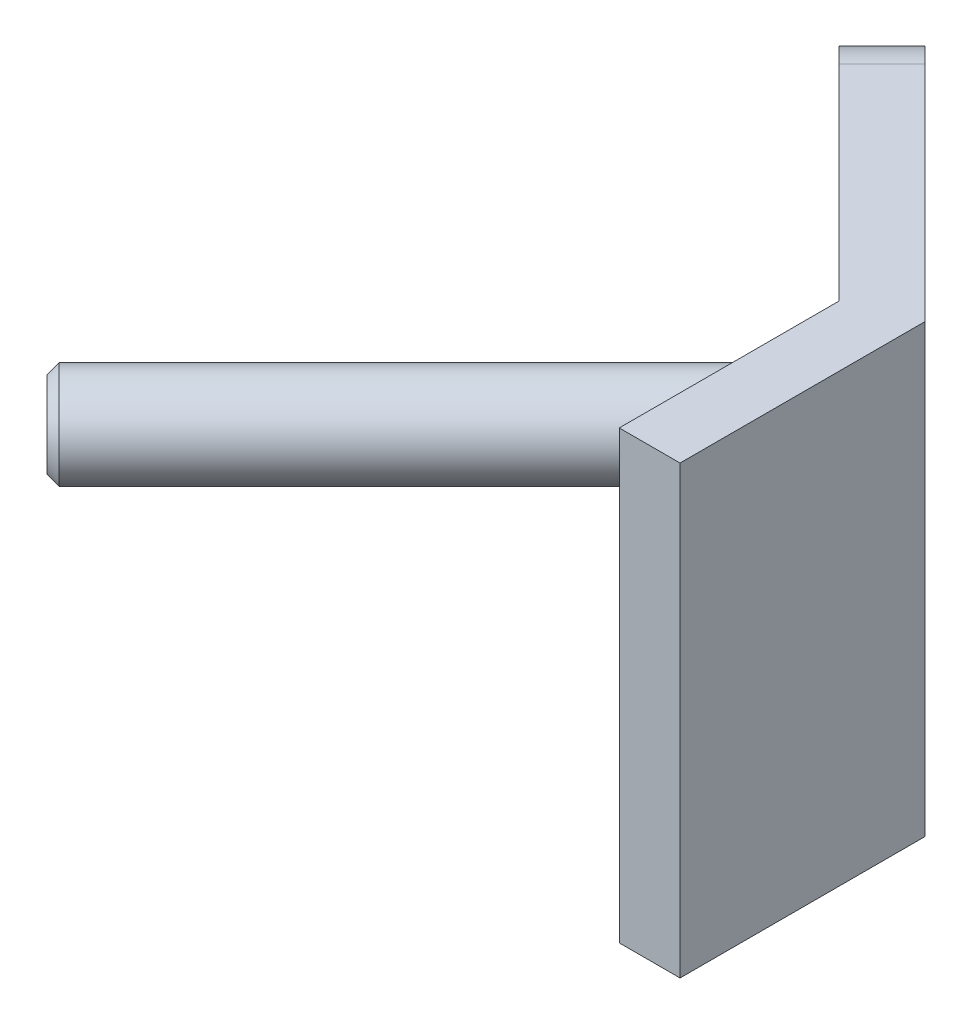
ISO-10303-21;
HEADER;
FILE_DESCRIPTION(('STEP AP214'),'2;1');
FILE_NAME('part.step','',(''),(''),'','','');
FILE_SCHEMA(('AUTOMOTIVE_DESIGN { 1 0 10303 214 1 1 1 1 }'));
ENDSEC;
DATA;
#1=APPLICATION_CONTEXT('core data for automotive mechanical design processes');
#2=APPLICATION_PROTOCOL_DEFINITION('international standard','automotive_design',2000,#1);
#3=PRODUCT_CONTEXT('',#1,'mechanical');
#4=PRODUCT('Part','Part','',(#3));
#5=PRODUCT_RELATED_PRODUCT_CATEGORY('part','',(#4));
#6=PRODUCT_DEFINITION_FORMATION('','',#4);
#7=PRODUCT_DEFINITION_CONTEXT('part definition',#1,'design');
#8=PRODUCT_DEFINITION('design','',#6,#7);
#9=PRODUCT_DEFINITION_SHAPE('','',#8);
#10=(LENGTH_UNIT() NAMED_UNIT(*) SI_UNIT(.MILLI.,.METRE.));
#11=(NAMED_UNIT(*) PLANE_ANGLE_UNIT() SI_UNIT($,.RADIAN.));
#12=(NAMED_UNIT(*) SI_UNIT($,.STERADIAN.) SOLID_ANGLE_UNIT());
#13=UNCERTAINTY_MEASURE_WITH_UNIT(LENGTH_MEASURE(1.E-05),#10,'distance_accuracy_value','');
#14=(GEOMETRIC_REPRESENTATION_CONTEXT(3) GLOBAL_UNCERTAINTY_ASSIGNED_CONTEXT((#13)) GLOBAL_UNIT_ASSIGNED_CONTEXT((#10,
#11,#12)) REPRESENTATION_CONTEXT('',''));
#15=CARTESIAN_POINT('',(0.,0.,0.));
#16=DIRECTION('',(0.,0.,1.));
#17=DIRECTION('',(1.,0.,0.));
#18=AXIS2_PLACEMENT_3D('',#15,#16,#17);
#19=CARTESIAN_POINT('',(-51.941801404264,0.,5.47010987737727));
#20=DIRECTION('',(0.707106781186548,0.,-0.707106781186547));
#21=DIRECTION('',(-0.707106781186547,0.,-0.707106781186548));
#22=AXIS2_PLACEMENT_3D('',#19,#20,#21);
#23=PLANE('',#22);
#24=CARTESIAN_POINT('',(-51.941801404264,0.,5.47010987737728));
#25=DIRECTION('',(0.707106781186548,0.,-0.707106781186547));
#26=DIRECTION('',(-0.707106781186547,0.,-0.707106781186548));
#27=AXIS2_PLACEMENT_3D('',#24,#25,#26);
#28=CIRCLE('',#27,3.175);
#29=CARTESIAN_POINT('',(-54.1868654345313,0.,3.22504584710999));
#30=VERTEX_POINT('',#29);
#31=EDGE_CURVE('E9',#30,#30,#28,.F.);
#32=ORIENTED_EDGE('',*,*,#31,.T.);
#33=EDGE_LOOP('',(#32));
#34=FACE_BOUND('',#33,.T.);
#35=ADVANCED_FACE('F15',(#34),#23,.F.);
#36=CARTESIAN_POINT('',(-105.823338130679,0.,59.3516466037921));
#37=DIRECTION('',(0.707106781186548,0.,-0.707106781186547));
#38=DIRECTION('',(-0.707106781186547,0.,-0.707106781186548));
#39=AXIS2_PLACEMENT_3D('',#36,#37,#38);
#40=CYLINDRICAL_SURFACE('',#39,3.96875);
#41=CARTESIAN_POINT('',(-51.3805353966972,0.,4.90884386981046));
#42=DIRECTION('',(0.707106781186547,0.,-0.707106781186547));
#43=DIRECTION('',(-0.707106781186548,0.,-0.707106781186548));
#44=AXIS2_PLACEMENT_3D('',#41,#42,#43);
#45=CIRCLE('',#44,3.96875);
#46=CARTESIAN_POINT('',(-54.1868654345313,0.,2.10251383197635));
#47=VERTEX_POINT('',#46);
#48=EDGE_CURVE('E23',#47,#47,#45,.T.);
#49=ORIENTED_EDGE('',*,*,#48,.T.);
#50=EDGE_LOOP('',(#49));
#51=FACE_BOUND('',#50,.T.);
#52=CARTESIAN_POINT('',(-16.0207769199874,0.,-30.4509146068993));
#53=DIRECTION('',(0.707106781186548,0.,-0.707106781186547));
#54=DIRECTION('',(-0.707106781186547,0.,-0.707106781186548));
#55=AXIS2_PLACEMENT_3D('',#52,#53,#54);
#56=CIRCLE('',#55,3.96875);
#57=CARTESIAN_POINT('',(-18.8271069578215,0.,-33.2572446447334));
#58=VERTEX_POINT('',#57);
#59=EDGE_CURVE('E128',#58,#58,#56,.T.);
#60=ORIENTED_EDGE('',*,*,#59,.F.);
#61=EDGE_LOOP('',(#60));
#62=FACE_BOUND('',#61,.T.);
#63=ADVANCED_FACE('F134',(#51,#62),#40,.T.);
#64=CARTESIAN_POINT('',(0.,-20.2184,0.));
#65=DIRECTION('',(-1.,0.,0.));
#66=DIRECTION('',(0.,0.,1.));
#67=AXIS2_PLACEMENT_3D('',#64,#65,#66);
#68=PLANE('',#67);
#69=DIRECTION('',(0.,0.,1.));
#70=VECTOR('',#69,1.);
#71=CARTESIAN_POINT('',(0.,20.2184,0.));
#72=LINE('',#71,#70);
#73=CARTESIAN_POINT('',(0.,20.2184,-22.225));
#74=VERTEX_POINT('',#73);
#75=CARTESIAN_POINT('',(0.,20.2184,0.));
#76=VERTEX_POINT('',#75);
#77=EDGE_CURVE('E107',#74,#76,#72,.T.);
#78=ORIENTED_EDGE('',*,*,#77,.T.);
#79=DIRECTION('',(0.,1.,0.));
#80=VECTOR('',#79,1.);
#81=CARTESIAN_POINT('',(0.,-20.2184,0.));
#82=LINE('',#81,#80);
#83=CARTESIAN_POINT('',(0.,-20.2184,0.));
#84=VERTEX_POINT('',#83);
#85=EDGE_CURVE('E85',#84,#76,#82,.T.);
#86=ORIENTED_EDGE('',*,*,#85,.F.);
#87=DIRECTION('',(0.,0.,1.));
#88=VECTOR('',#87,1.);
#89=CARTESIAN_POINT('',(0.,-20.2184,0.));
#90=LINE('',#89,#88);
#91=CARTESIAN_POINT('',(0.,-20.2184,-22.225));
#92=VERTEX_POINT('',#91);
#93=EDGE_CURVE('E92',#92,#84,#90,.T.);
#94=ORIENTED_EDGE('',*,*,#93,.F.);
#95=DIRECTION('',(0.,1.,0.));
#96=VECTOR('',#95,1.);
#97=CARTESIAN_POINT('',(0.,-20.2184,-22.225));
#98=LINE('',#97,#96);
#99=EDGE_CURVE('E350',#92,#74,#98,.T.);
#100=ORIENTED_EDGE('',*,*,#99,.T.);
#101=EDGE_LOOP('',(#78,#86,#94,#100));
#102=FACE_BOUND('',#101,.T.);
#103=ADVANCED_FACE('F105',(#102),#68,.F.);
#104=CARTESIAN_POINT('',(0.,-20.2184,0.));
#105=DIRECTION('',(0.,0.,-1.));
#106=DIRECTION('',(-1.,0.,0.));
#107=AXIS2_PLACEMENT_3D('',#104,#105,#106);
#108=PLANE('',#107);
#109=DIRECTION('',(-1.,0.,0.));
#110=VECTOR('',#109,1.);
#111=CARTESIAN_POINT('',(0.,20.2184,0.));
#112=LINE('',#111,#110);
#113=CARTESIAN_POINT('',(-5.5118,20.2184,0.));
#114=VERTEX_POINT('',#113);
#115=EDGE_CURVE('E355',#76,#114,#112,.T.);
#116=ORIENTED_EDGE('',*,*,#115,.T.);
#117=DIRECTION('',(0.,1.,0.));
#118=VECTOR('',#117,1.);
#119=CARTESIAN_POINT('',(-5.5118,-20.2184,0.));
#120=LINE('',#119,#118);
#121=CARTESIAN_POINT('',(-5.5118,-20.2184,0.));
#122=VERTEX_POINT('',#121);
#123=EDGE_CURVE('E88',#122,#114,#120,.T.);
#124=ORIENTED_EDGE('',*,*,#123,.F.);
#125=DIRECTION('',(-1.,0.,0.));
#126=VECTOR('',#125,1.);
#127=CARTESIAN_POINT('',(0.,-20.2184,0.));
#128=LINE('',#127,#126);
#129=EDGE_CURVE('E81',#84,#122,#128,.T.);
#130=ORIENTED_EDGE('',*,*,#129,.F.);
#131=ORIENTED_EDGE('',*,*,#85,.T.);
#132=EDGE_LOOP('',(#116,#124,#130,#131));
#133=FACE_BOUND('',#132,.T.);
#134=ADVANCED_FACE('F83',(#133),#108,.F.);
#135=CARTESIAN_POINT('',(-5.5118,-20.2184,0.));
#136=DIRECTION('',(1.,0.,0.));
#137=DIRECTION('',(0.,0.,-1.));
#138=AXIS2_PLACEMENT_3D('',#135,#136,#137);
#139=PLANE('',#138);
#140=DIRECTION('',(0.,0.,-1.));
#141=VECTOR('',#140,1.);
#142=CARTESIAN_POINT('',(-5.5118,20.2184,0.));
#143=LINE('',#142,#141);
#144=CARTESIAN_POINT('',(-5.5118,20.2184,-19.941937686912));
#145=VERTEX_POINT('',#144);
#146=EDGE_CURVE('E359',#114,#145,#143,.T.);
#147=ORIENTED_EDGE('',*,*,#146,.T.);
#148=DIRECTION('',(0.,1.,0.));
#149=VECTOR('',#148,1.);
#150=CARTESIAN_POINT('',(-5.5118,-20.2184,-19.941937686912));
#151=LINE('',#150,#149);
#152=CARTESIAN_POINT('',(-5.5118,-20.2184,-19.941937686912));
#153=VERTEX_POINT('',#152);
#154=EDGE_CURVE('E112',#153,#145,#151,.T.);
#155=ORIENTED_EDGE('',*,*,#154,.F.);
#156=DIRECTION('',(0.,0.,-1.));
#157=VECTOR('',#156,1.);
#158=CARTESIAN_POINT('',(-5.5118,-20.2184,0.));
#159=LINE('',#158,#157);
#160=EDGE_CURVE('E91',#122,#153,#159,.T.);
#161=ORIENTED_EDGE('',*,*,#160,.F.);
#162=ORIENTED_EDGE('',*,*,#123,.T.);
#163=EDGE_LOOP('',(#147,#155,#161,#162));
#164=FACE_BOUND('',#163,.T.);
#165=ADVANCED_FACE('F163',(#164),#139,.F.);
#166=CARTESIAN_POINT('',(-28.5931354894842,-20.2184,-43.0232731763962));
#167=DIRECTION('',(0.707106781186548,0.,-0.707106781186547));
#168=DIRECTION('',(-0.707106781186547,0.,-0.707106781186548));
#169=AXIS2_PLACEMENT_3D('',#166,#167,#168);
#170=PLANE('',#169);
#171=ORIENTED_EDGE('',*,*,#59,.T.);
#172=EDGE_LOOP('',(#171));
#173=FACE_BOUND('',#172,.T.);
#174=DIRECTION('',(-0.707106781186547,0.,-0.707106781186548));
#175=VECTOR('',#174,1.);
#176=CARTESIAN_POINT('',(-28.5931354894842,20.2184,-43.0232731763962));
#177=LINE('',#176,#175);
#178=CARTESIAN_POINT('',(-24.1030074289496,20.2184,-38.5331451158616));
#179=VERTEX_POINT('',#178);
#180=EDGE_CURVE('E336',#145,#179,#177,.T.);
#181=ORIENTED_EDGE('',*,*,#180,.T.);
#182=CARTESIAN_POINT('',(-24.1030074289496,13.8684,-38.5331451158616));
#183=DIRECTION('',(0.707106781186548,0.,-0.707106781186547));
#184=DIRECTION('',(-0.707106781186547,0.,-0.707106781186548));
#185=AXIS2_PLACEMENT_3D('',#182,#183,#184);
#186=CIRCLE('',#185,6.35);
#187=CARTESIAN_POINT('',(-28.5931354894842,13.8684,-43.0232731763962));
#188=VERTEX_POINT('',#187);
#189=EDGE_CURVE('E126',#179,#188,#186,.F.);
#190=ORIENTED_EDGE('',*,*,#189,.T.);
#191=DIRECTION('',(0.,1.,0.));
#192=VECTOR('',#191,1.);
#193=CARTESIAN_POINT('',(-28.5931354894842,-20.2184,-43.0232731763962));
#194=LINE('',#193,#192);
#195=CARTESIAN_POINT('',(-28.5931354894842,-13.8684,-43.0232731763962));
#196=VERTEX_POINT('',#195);
#197=EDGE_CURVE('E343',#196,#188,#194,.T.);
#198=ORIENTED_EDGE('',*,*,#197,.F.);
#199=CARTESIAN_POINT('',(-24.1030074289496,-13.8684,-38.5331451158616));
#200=DIRECTION('',(0.707106781186548,0.,-0.707106781186547));
#201=DIRECTION('',(-0.707106781186547,0.,-0.707106781186548));
#202=AXIS2_PLACEMENT_3D('',#199,#200,#201);
#203=CIRCLE('',#202,6.35);
#204=CARTESIAN_POINT('',(-24.1030074289496,-20.2184,-38.5331451158616));
#205=VERTEX_POINT('',#204);
#206=EDGE_CURVE('E119',#196,#205,#203,.F.);
#207=ORIENTED_EDGE('',*,*,#206,.T.);
#208=DIRECTION('',(-0.707106781186547,0.,-0.707106781186548));
#209=VECTOR('',#208,1.);
#210=CARTESIAN_POINT('',(-28.5931354894842,-20.2184,-43.0232731763962));
#211=LINE('',#210,#209);
#212=EDGE_CURVE('E365',#153,#205,#211,.T.);
#213=ORIENTED_EDGE('',*,*,#212,.F.);
#214=ORIENTED_EDGE('',*,*,#154,.T.);
#215=EDGE_LOOP('',(#181,#190,#198,#207,#213,#214));
#216=FACE_BOUND('',#215,.T.);
#217=ADVANCED_FACE('F166',(#173,#216),#170,.F.);
#218=CARTESIAN_POINT('',(-24.6957043329402,-20.2184,-46.9207043329402));
#219=DIRECTION('',(0.707106781186547,0.,0.707106781186548));
#220=DIRECTION('',(0.707106781186548,0.,-0.707106781186547));
#221=AXIS2_PLACEMENT_3D('',#218,#219,#220);
#222=PLANE('',#221);
#223=ORIENTED_EDGE('',*,*,#197,.T.);
#224=DIRECTION('',(0.707106781186548,0.,-0.707106781186547));
#225=VECTOR('',#224,1.);
#226=CARTESIAN_POINT('',(-24.6957043329402,13.8684,-46.9207043329402));
#227=LINE('',#226,#225);
#228=CARTESIAN_POINT('',(-24.6957043329402,13.8684,-46.9207043329402));
#229=VERTEX_POINT('',#228);
#230=EDGE_CURVE('E121',#188,#229,#227,.T.);
#231=ORIENTED_EDGE('',*,*,#230,.T.);
#232=DIRECTION('',(0.,1.,0.));
#233=VECTOR('',#232,1.);
#234=CARTESIAN_POINT('',(-24.6957043329402,-20.2184,-46.9207043329402));
#235=LINE('',#234,#233);
#236=CARTESIAN_POINT('',(-24.6957043329402,-13.8684,-46.9207043329402));
#237=VERTEX_POINT('',#236);
#238=EDGE_CURVE('E348',#237,#229,#235,.T.);
#239=ORIENTED_EDGE('',*,*,#238,.F.);
#240=DIRECTION('',(0.707106781186548,0.,-0.707106781186547));
#241=VECTOR('',#240,1.);
#242=CARTESIAN_POINT('',(-28.5931354894842,-13.8684,-43.0232731763962));
#243=LINE('',#242,#241);
#244=EDGE_CURVE('E117',#237,#196,#243,.F.);
#245=ORIENTED_EDGE('',*,*,#244,.T.);
#246=EDGE_LOOP('',(#223,#231,#239,#245));
#247=FACE_BOUND('',#246,.T.);
#248=ADVANCED_FACE('F170',(#247),#222,.F.);
#249=CARTESIAN_POINT('',(0.,-20.2184,-22.225));
#250=DIRECTION('',(-0.707106781186548,0.,0.707106781186548));
#251=DIRECTION('',(0.707106781186548,0.,0.707106781186548));
#252=AXIS2_PLACEMENT_3D('',#249,#250,#251);
#253=PLANE('',#252);
#254=ORIENTED_EDGE('',*,*,#238,.T.);
#255=CARTESIAN_POINT('',(-20.2055762724056,13.8684,-42.4305762724056));
#256=DIRECTION('',(-0.707106781186548,0.,0.707106781186548));
#257=DIRECTION('',(0.707106781186548,0.,0.707106781186548));
#258=AXIS2_PLACEMENT_3D('',#255,#256,#257);
#259=CIRCLE('',#258,6.35);
#260=CARTESIAN_POINT('',(-20.2055762724056,20.2184,-42.4305762724056));
#261=VERTEX_POINT('',#260);
#262=EDGE_CURVE('E38',#229,#261,#259,.F.);
#263=ORIENTED_EDGE('',*,*,#262,.T.);
#264=DIRECTION('',(0.707106781186548,0.,0.707106781186548));
#265=VECTOR('',#264,1.);
#266=CARTESIAN_POINT('',(0.,20.2184,-22.225));
#267=LINE('',#266,#265);
#268=EDGE_CURVE('E103',#261,#74,#267,.T.);
#269=ORIENTED_EDGE('',*,*,#268,.T.);
#270=ORIENTED_EDGE('',*,*,#99,.F.);
#271=DIRECTION('',(0.707106781186548,0.,0.707106781186548));
#272=VECTOR('',#271,1.);
#273=CARTESIAN_POINT('',(0.,-20.2184,-22.225));
#274=LINE('',#273,#272);
#275=CARTESIAN_POINT('',(-20.2055762724056,-20.2184,-42.4305762724056));
#276=VERTEX_POINT('',#275);
#277=EDGE_CURVE('E99',#276,#92,#274,.T.);
#278=ORIENTED_EDGE('',*,*,#277,.F.);
#279=CARTESIAN_POINT('',(-20.2055762724056,-13.8684,-42.4305762724056));
#280=DIRECTION('',(-0.707106781186548,0.,0.707106781186548));
#281=DIRECTION('',(0.707106781186548,0.,0.707106781186548));
#282=AXIS2_PLACEMENT_3D('',#279,#280,#281);
#283=CIRCLE('',#282,6.35);
#284=EDGE_CURVE('E110',#276,#237,#283,.F.);
#285=ORIENTED_EDGE('',*,*,#284,.T.);
#286=EDGE_LOOP('',(#254,#263,#269,#270,#278,#285));
#287=FACE_BOUND('',#286,.T.);
#288=ADVANCED_FACE('F174',(#287),#253,.F.);
#289=CARTESIAN_POINT('',(0.,-20.2184,0.));
#290=DIRECTION('',(0.,-1.,0.));
#291=DIRECTION('',(0.,0.,-1.));
#292=AXIS2_PLACEMENT_3D('',#289,#290,#291);
#293=PLANE('',#292);
#294=ORIENTED_EDGE('',*,*,#212,.T.);
#295=DIRECTION('',(0.707106781186548,0.,-0.707106781186547));
#296=VECTOR('',#295,1.);
#297=CARTESIAN_POINT('',(-20.2055762724056,-20.2184,-42.4305762724056));
#298=LINE('',#297,#296);
#299=EDGE_CURVE('E108',#205,#276,#298,.T.);
#300=ORIENTED_EDGE('',*,*,#299,.T.);
#301=ORIENTED_EDGE('',*,*,#277,.T.);
#302=ORIENTED_EDGE('',*,*,#93,.T.);
#303=ORIENTED_EDGE('',*,*,#129,.T.);
#304=ORIENTED_EDGE('',*,*,#160,.T.);
#305=EDGE_LOOP('',(#294,#300,#301,#302,#303,#304));
#306=FACE_BOUND('',#305,.T.);
#307=ADVANCED_FACE('F96',(#306),#293,.T.);
#308=CARTESIAN_POINT('',(0.,20.2184,0.));
#309=DIRECTION('',(0.,-1.,0.));
#310=DIRECTION('',(0.,0.,-1.));
#311=AXIS2_PLACEMENT_3D('',#308,#309,#310);
#312=PLANE('',#311);
#313=ORIENTED_EDGE('',*,*,#268,.F.);
#314=DIRECTION('',(0.707106781186548,0.,-0.707106781186547));
#315=VECTOR('',#314,1.);
#316=CARTESIAN_POINT('',(-31.3180762724056,20.2184,-31.3180762724056));
#317=LINE('',#316,#315);
#318=EDGE_CURVE('E30',#261,#179,#317,.F.);
#319=ORIENTED_EDGE('',*,*,#318,.T.);
#320=ORIENTED_EDGE('',*,*,#180,.F.);
#321=ORIENTED_EDGE('',*,*,#146,.F.);
#322=ORIENTED_EDGE('',*,*,#115,.F.);
#323=ORIENTED_EDGE('',*,*,#77,.F.);
#324=EDGE_LOOP('',(#313,#319,#320,#321,#322,#323));
#325=FACE_BOUND('',#324,.T.);
#326=ADVANCED_FACE('F157',(#325),#312,.F.);
#327=CARTESIAN_POINT('',(-31.3180762724056,-13.8684,-31.3180762724056));
#328=DIRECTION('',(-0.707106781186548,0.,0.707106781186547));
#329=DIRECTION('',(0.707106781186547,0.,0.707106781186548));
#330=AXIS2_PLACEMENT_3D('',#327,#328,#329);
#331=CYLINDRICAL_SURFACE('',#330,6.35);
#332=ORIENTED_EDGE('',*,*,#206,.F.);
#333=ORIENTED_EDGE('',*,*,#244,.F.);
#334=ORIENTED_EDGE('',*,*,#284,.F.);
#335=ORIENTED_EDGE('',*,*,#299,.F.);
#336=EDGE_LOOP('',(#332,#333,#334,#335));
#337=FACE_BOUND('',#336,.T.);
#338=ADVANCED_FACE('F144',(#337),#331,.T.);
#339=CARTESIAN_POINT('',(-20.2055762724056,13.8684,-42.4305762724056));
#340=DIRECTION('',(0.707106781186548,0.,-0.707106781186547));
#341=DIRECTION('',(-0.707106781186547,0.,-0.707106781186548));
#342=AXIS2_PLACEMENT_3D('',#339,#340,#341);
#343=CYLINDRICAL_SURFACE('',#342,6.35);
#344=ORIENTED_EDGE('',*,*,#189,.F.);
#345=ORIENTED_EDGE('',*,*,#318,.F.);
#346=ORIENTED_EDGE('',*,*,#262,.F.);
#347=ORIENTED_EDGE('',*,*,#230,.F.);
#348=EDGE_LOOP('',(#344,#345,#346,#347));
#349=FACE_BOUND('',#348,.T.);
#350=ADVANCED_FACE('F138',(#349),#343,.T.);
#351=CARTESIAN_POINT('',(-51.3805353966972,0.,4.90884386981046));
#352=DIRECTION('',(0.707106781186547,0.,-0.707106781186547));
#353=DIRECTION('',(-0.707106781186548,0.,-0.707106781186548));
#354=AXIS2_PLACEMENT_3D('',#351,#352,#353);
#355=CONICAL_SURFACE('',#354,3.96875,0.785398163397449);
#356=CARTESIAN_POINT('',(-54.1868654345313,0.,3.22504584710999));
#357=CARTESIAN_POINT('',(-54.1868654345313,0.,3.21335280528568));
#358=CARTESIAN_POINT('',(-54.1868654345313,0.,3.20165976346137));
#359=CARTESIAN_POINT('',(-54.1868654345313,0.,3.17827367981276));
#360=CARTESIAN_POINT('',(-54.1868654345313,0.,3.16658063798845));
#361=CARTESIAN_POINT('',(-54.1868654345313,0.,3.14319455433983));
#362=CARTESIAN_POINT('',(-54.1868654345313,0.,3.13150151251552));
#363=CARTESIAN_POINT('',(-54.1868654345313,0.,3.1081154288669));
#364=CARTESIAN_POINT('',(-54.1868654345313,0.,3.0964223870426));
#365=CARTESIAN_POINT('',(-54.1868654345313,0.,3.07303630339398));
#366=CARTESIAN_POINT('',(-54.1868654345313,0.,3.06134326156967));
#367=CARTESIAN_POINT('',(-54.1868654345313,0.,3.03795717792105));
#368=CARTESIAN_POINT('',(-54.1868654345313,0.,3.02626413609674));
#369=CARTESIAN_POINT('',(-54.1868654345313,0.,3.00287805244813));
#370=CARTESIAN_POINT('',(-54.1868654345313,0.,2.99118501062382));
#371=CARTESIAN_POINT('',(-54.1868654345313,0.,2.9677989269752));
#372=CARTESIAN_POINT('',(-54.1868654345313,0.,2.95610588515089));
#373=CARTESIAN_POINT('',(-54.1868654345313,0.,2.93271980150227));
#374=CARTESIAN_POINT('',(-54.1868654345313,0.,2.92102675967796));
#375=CARTESIAN_POINT('',(-54.1868654345313,0.,2.89764067602935));
#376=CARTESIAN_POINT('',(-54.1868654345313,0.,2.88594763420504));
#377=CARTESIAN_POINT('',(-54.1868654345313,0.,2.86256155055642));
#378=CARTESIAN_POINT('',(-54.1868654345313,0.,2.85086850873211));
#379=CARTESIAN_POINT('',(-54.1868654345313,0.,2.82748242508349));
#380=CARTESIAN_POINT('',(-54.1868654345313,0.,2.81578938325919));
#381=CARTESIAN_POINT('',(-54.1868654345313,0.,2.79240329961057));
#382=CARTESIAN_POINT('',(-54.1868654345313,0.,2.78071025778626));
#383=CARTESIAN_POINT('',(-54.1868654345313,0.,2.75732417413764));
#384=CARTESIAN_POINT('',(-54.1868654345313,0.,2.74563113231333));
#385=CARTESIAN_POINT('',(-54.1868654345313,0.,2.72224504866471));
#386=CARTESIAN_POINT('',(-54.1868654345313,0.,2.71055200684041));
#387=CARTESIAN_POINT('',(-54.1868654345313,0.,2.68716592319179));
#388=CARTESIAN_POINT('',(-54.1868654345313,0.,2.67547288136748));
#389=CARTESIAN_POINT('',(-54.1868654345313,0.,2.65208679771886));
#390=CARTESIAN_POINT('',(-54.1868654345313,0.,2.64039375589455));
#391=CARTESIAN_POINT('',(-54.1868654345313,0.,2.61700767224594));
#392=CARTESIAN_POINT('',(-54.1868654345313,0.,2.60531463042163));
#393=CARTESIAN_POINT('',(-54.1868654345313,0.,2.58192854677301));
#394=CARTESIAN_POINT('',(-54.1868654345313,0.,2.5702355049487));
#395=CARTESIAN_POINT('',(-54.1868654345313,0.,2.54684942130008));
#396=CARTESIAN_POINT('',(-54.1868654345313,0.,2.53515637947577));
#397=CARTESIAN_POINT('',(-54.1868654345313,0.,2.51177029582716));
#398=CARTESIAN_POINT('',(-54.1868654345313,0.,2.50007725400285));
#399=CARTESIAN_POINT('',(-54.1868654345313,0.,2.47669117035423));
#400=CARTESIAN_POINT('',(-54.1868654345313,0.,2.46499812852992));
#401=CARTESIAN_POINT('',(-54.1868654345313,0.,2.4416120448813));
#402=CARTESIAN_POINT('',(-54.1868654345313,0.,2.429919003057));
#403=CARTESIAN_POINT('',(-54.1868654345313,0.,2.40653291940838));
#404=CARTESIAN_POINT('',(-54.1868654345313,0.,2.39483987758407));
#405=CARTESIAN_POINT('',(-54.1868654345313,0.,2.37145379393545));
#406=CARTESIAN_POINT('',(-54.1868654345313,0.,2.35976075211114));
#407=CARTESIAN_POINT('',(-54.1868654345313,0.,2.33637466846253));
#408=CARTESIAN_POINT('',(-54.1868654345313,0.,2.32468162663822));
#409=CARTESIAN_POINT('',(-54.1868654345313,0.,2.3012955429896));
#410=CARTESIAN_POINT('',(-54.1868654345313,0.,2.28960250116529));
#411=CARTESIAN_POINT('',(-54.1868654345313,0.,2.26621641751667));
#412=CARTESIAN_POINT('',(-54.1868654345313,0.,2.25452337569236));
#413=CARTESIAN_POINT('',(-54.1868654345313,0.,2.23113729204375));
#414=CARTESIAN_POINT('',(-54.1868654345313,0.,2.21944425021944));
#415=CARTESIAN_POINT('',(-54.1868654345313,0.,2.19605816657082));
#416=CARTESIAN_POINT('',(-54.1868654345313,0.,2.18436512474651));
#417=CARTESIAN_POINT('',(-54.1868654345313,0.,2.16097904109789));
#418=CARTESIAN_POINT('',(-54.1868654345313,0.,2.14928599927359));
#419=CARTESIAN_POINT('',(-54.1868654345313,0.,2.12589991562497));
#420=CARTESIAN_POINT('',(-54.1868654345313,0.,2.11420687380066));
#421=CARTESIAN_POINT('',(-54.1868654345313,0.,2.10251383197635));
#422=B_SPLINE_CURVE_WITH_KNOTS('',3,(#356,#357,#358,#359,#360,#361,#362,#363,#364,#365,#366,
#367,#368,#369,#370,#371,#372,#373,#374,#375,#376,#377,#378,#379,#380,#381,#382,#383,#384,#385,
#386,#387,#388,#389,#390,#391,#392,#393,#394,#395,#396,#397,#398,#399,#400,#401,#402,#403,#404,
#405,#406,#407,#408,#409,#410,#411,#412,#413,#414,#415,#416,#417,#418,#419,#420,#421),
.UNSPECIFIED.,.F.,.F.,(4,2,2,2,2,2,2,2,2,2,2,2,2,2,2,2,2,2,2,2,2,2,2,2,2,2,2,2,2,2,2,2,4),(0.,
0.0350791254729267,0.0701582509458525,0.105237376418779,0.140316501891705,0.175395627364632,
0.210474752837558,0.245553878310484,0.280633003783411,0.315712129256337,0.350791254729263,
0.38587038020219,0.420949505675116,0.456028631148042,0.491107756620969,0.526186882093895,
0.561266007566821,0.596345133039748,0.631424258512674,0.6665033839856,0.701582509458527,
0.736661634931453,0.77174076040438,0.806819885877305,0.841899011350232,0.876978136823159,
0.912057262296085,0.947136387769011,0.982215513241937,1.01729463871486,1.05237376418779,
1.08745288966072,1.12253201513364),.UNSPECIFIED.);
#423=EDGE_CURVE('BSEAM17',#30,#47,#422,.T.);
#424=ORIENTED_EDGE('',*,*,#31,.F.);
#425=ORIENTED_EDGE('',*,*,#48,.F.);
#426=ORIENTED_EDGE('',*,*,#423,.T.);
#427=ORIENTED_EDGE('',*,*,#423,.F.);
#428=EDGE_LOOP('',(#424,#426,#425,#427));
#429=FACE_BOUND('',#428,.T.);
#430=ADVANCED_FACE('F17',(#429),#355,.T.);
#431=CLOSED_SHELL('',(#35,#63,#103,#134,#165,#217,#248,#288,#307,#326,#338,#350,#430));
#432=MANIFOLD_SOLID_BREP('B1',#431);
#433=ADVANCED_BREP_SHAPE_REPRESENTATION('',(#18,#432),#14);
#434=SHAPE_DEFINITION_REPRESENTATION(#9,#433);
ENDSEC;
END-ISO-10303-21;
